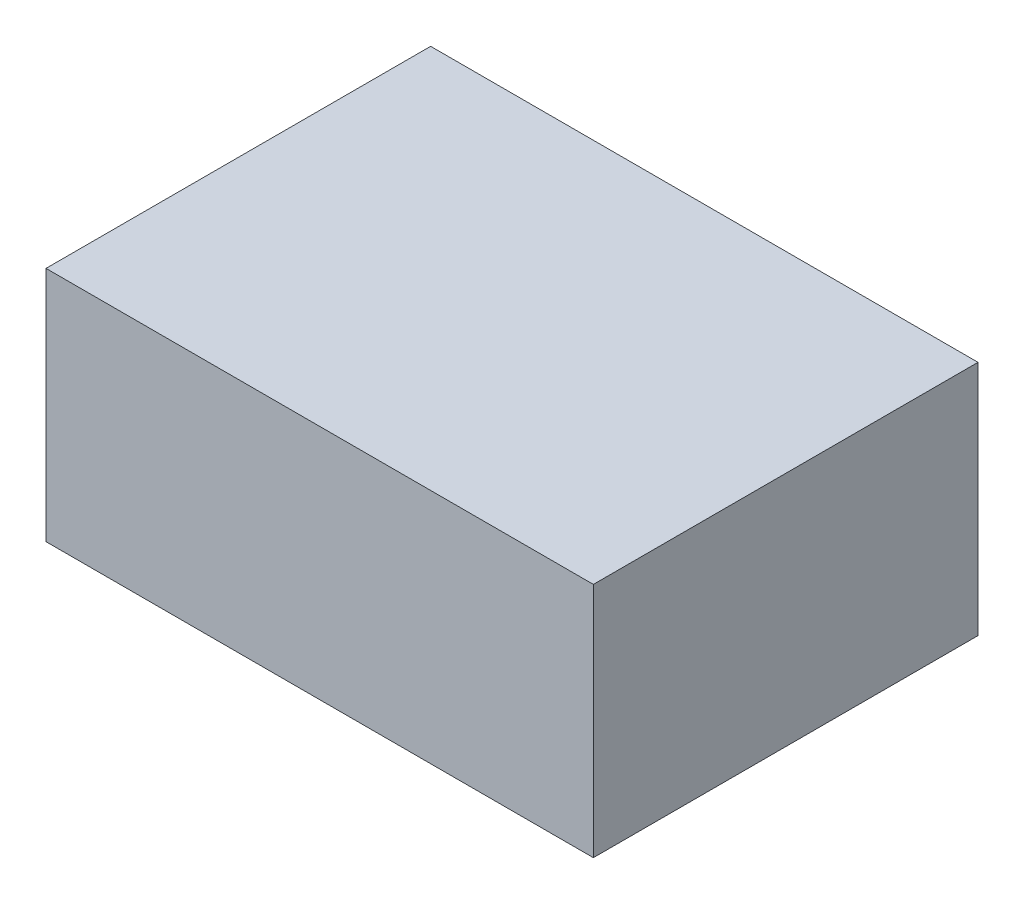
ISO-10303-21;
HEADER;
FILE_DESCRIPTION(('STEP AP214'),'2;1');
FILE_NAME('part.step','',(''),(''),'','','');
FILE_SCHEMA(('AUTOMOTIVE_DESIGN { 1 0 10303 214 1 1 1 1 }'));
ENDSEC;
DATA;
#1=APPLICATION_CONTEXT('core data for automotive mechanical design processes');
#2=APPLICATION_PROTOCOL_DEFINITION('international standard','automotive_design',2000,#1);
#3=PRODUCT_CONTEXT('',#1,'mechanical');
#4=PRODUCT('Part','Part','',(#3));
#5=PRODUCT_RELATED_PRODUCT_CATEGORY('part','',(#4));
#6=PRODUCT_DEFINITION_FORMATION('','',#4);
#7=PRODUCT_DEFINITION_CONTEXT('part definition',#1,'design');
#8=PRODUCT_DEFINITION('design','',#6,#7);
#9=PRODUCT_DEFINITION_SHAPE('','',#8);
#10=(LENGTH_UNIT() NAMED_UNIT(*) SI_UNIT(.MILLI.,.METRE.));
#11=(NAMED_UNIT(*) PLANE_ANGLE_UNIT() SI_UNIT($,.RADIAN.));
#12=(NAMED_UNIT(*) SI_UNIT($,.STERADIAN.) SOLID_ANGLE_UNIT());
#13=UNCERTAINTY_MEASURE_WITH_UNIT(LENGTH_MEASURE(1.E-05),#10,'distance_accuracy_value','');
#14=(GEOMETRIC_REPRESENTATION_CONTEXT(3) GLOBAL_UNCERTAINTY_ASSIGNED_CONTEXT((#13)) GLOBAL_UNIT_ASSIGNED_CONTEXT((#10,
#11,#12)) REPRESENTATION_CONTEXT('',''));
#15=CARTESIAN_POINT('',(0.,0.,0.));
#16=DIRECTION('',(0.,0.,1.));
#17=DIRECTION('',(1.,0.,0.));
#18=AXIS2_PLACEMENT_3D('',#15,#16,#17);
#19=CARTESIAN_POINT('',(46.99,20.32,33.02));
#20=DIRECTION('',(-1.,0.,0.));
#21=DIRECTION('',(0.,0.,1.));
#22=AXIS2_PLACEMENT_3D('',#19,#20,#21);
#23=PLANE('',#22);
#24=DIRECTION('',(0.,0.,-1.));
#25=VECTOR('',#24,1.);
#26=CARTESIAN_POINT('',(46.99,-20.32,33.02));
#27=LINE('',#26,#25);
#28=CARTESIAN_POINT('',(46.99,-20.32,33.02));
#29=VERTEX_POINT('',#28);
#30=CARTESIAN_POINT('',(46.99,-20.32,-33.02));
#31=VERTEX_POINT('',#30);
#32=EDGE_CURVE('E107',#29,#31,#27,.T.);
#33=ORIENTED_EDGE('',*,*,#32,.T.);
#34=DIRECTION('',(0.,-1.,0.));
#35=VECTOR('',#34,1.);
#36=CARTESIAN_POINT('',(46.99,20.32,-33.02));
#37=LINE('',#36,#35);
#38=CARTESIAN_POINT('',(46.99,20.32,-33.02));
#39=VERTEX_POINT('',#38);
#40=EDGE_CURVE('E11',#39,#31,#37,.T.);
#41=ORIENTED_EDGE('',*,*,#40,.F.);
#42=DIRECTION('',(0.,0.,-1.));
#43=VECTOR('',#42,1.);
#44=CARTESIAN_POINT('',(46.99,20.32,33.02));
#45=LINE('',#44,#43);
#46=CARTESIAN_POINT('',(46.99,20.32,33.02));
#47=VERTEX_POINT('',#46);
#48=EDGE_CURVE('E91',#47,#39,#45,.T.);
#49=ORIENTED_EDGE('',*,*,#48,.F.);
#50=DIRECTION('',(0.,-1.,0.));
#51=VECTOR('',#50,1.);
#52=CARTESIAN_POINT('',(46.99,20.32,33.02));
#53=LINE('',#52,#51);
#54=EDGE_CURVE('E103',#47,#29,#53,.T.);
#55=ORIENTED_EDGE('',*,*,#54,.T.);
#56=EDGE_LOOP('',(#33,#41,#49,#55));
#57=FACE_BOUND('',#56,.T.);
#58=ADVANCED_FACE('F39',(#57),#23,.F.);
#59=CARTESIAN_POINT('',(-46.99,20.32,-33.02));
#60=DIRECTION('',(0.,0.,1.));
#61=DIRECTION('',(1.,0.,0.));
#62=AXIS2_PLACEMENT_3D('',#59,#60,#61);
#63=PLANE('',#62);
#64=DIRECTION('',(-1.,0.,0.));
#65=VECTOR('',#64,1.);
#66=CARTESIAN_POINT('',(-46.99,-20.32,-33.02));
#67=LINE('',#66,#65);
#68=CARTESIAN_POINT('',(-46.99,-20.32,-33.02));
#69=VERTEX_POINT('',#68);
#70=EDGE_CURVE('E96',#31,#69,#67,.T.);
#71=ORIENTED_EDGE('',*,*,#70,.T.);
#72=DIRECTION('',(0.,-1.,0.));
#73=VECTOR('',#72,1.);
#74=CARTESIAN_POINT('',(-46.99,20.32,-33.02));
#75=LINE('',#74,#73);
#76=CARTESIAN_POINT('',(-46.99,20.32,-33.02));
#77=VERTEX_POINT('',#76);
#78=EDGE_CURVE('E48',#77,#69,#75,.T.);
#79=ORIENTED_EDGE('',*,*,#78,.F.);
#80=DIRECTION('',(-1.,0.,0.));
#81=VECTOR('',#80,1.);
#82=CARTESIAN_POINT('',(-46.99,20.32,-33.02));
#83=LINE('',#82,#81);
#84=EDGE_CURVE('E86',#39,#77,#83,.T.);
#85=ORIENTED_EDGE('',*,*,#84,.F.);
#86=ORIENTED_EDGE('',*,*,#40,.T.);
#87=EDGE_LOOP('',(#71,#79,#85,#86));
#88=FACE_BOUND('',#87,.T.);
#89=ADVANCED_FACE('F95',(#88),#63,.F.);
#90=CARTESIAN_POINT('',(-46.99,20.32,33.02));
#91=DIRECTION('',(1.,0.,0.));
#92=DIRECTION('',(0.,0.,-1.));
#93=AXIS2_PLACEMENT_3D('',#90,#91,#92);
#94=PLANE('',#93);
#95=DIRECTION('',(0.,0.,1.));
#96=VECTOR('',#95,1.);
#97=CARTESIAN_POINT('',(-46.99,-20.32,33.02));
#98=LINE('',#97,#96);
#99=CARTESIAN_POINT('',(-46.99,-20.32,33.02));
#100=VERTEX_POINT('',#99);
#101=EDGE_CURVE('E73',#69,#100,#98,.T.);
#102=ORIENTED_EDGE('',*,*,#101,.T.);
#103=DIRECTION('',(0.,-1.,0.));
#104=VECTOR('',#103,1.);
#105=CARTESIAN_POINT('',(-46.99,20.32,33.02));
#106=LINE('',#105,#104);
#107=CARTESIAN_POINT('',(-46.99,20.32,33.02));
#108=VERTEX_POINT('',#107);
#109=EDGE_CURVE('E98',#108,#100,#106,.T.);
#110=ORIENTED_EDGE('',*,*,#109,.F.);
#111=DIRECTION('',(0.,0.,1.));
#112=VECTOR('',#111,1.);
#113=CARTESIAN_POINT('',(-46.99,20.32,33.02));
#114=LINE('',#113,#112);
#115=EDGE_CURVE('E89',#77,#108,#114,.T.);
#116=ORIENTED_EDGE('',*,*,#115,.F.);
#117=ORIENTED_EDGE('',*,*,#78,.T.);
#118=EDGE_LOOP('',(#102,#110,#116,#117));
#119=FACE_BOUND('',#118,.T.);
#120=ADVANCED_FACE('F99',(#119),#94,.F.);
#121=CARTESIAN_POINT('',(-46.99,20.32,33.02));
#122=DIRECTION('',(0.,0.,-1.));
#123=DIRECTION('',(-1.,0.,0.));
#124=AXIS2_PLACEMENT_3D('',#121,#122,#123);
#125=PLANE('',#124);
#126=DIRECTION('',(1.,0.,0.));
#127=VECTOR('',#126,1.);
#128=CARTESIAN_POINT('',(-46.99,-20.32,33.02));
#129=LINE('',#128,#127);
#130=EDGE_CURVE('E79',#100,#29,#129,.T.);
#131=ORIENTED_EDGE('',*,*,#130,.T.);
#132=ORIENTED_EDGE('',*,*,#54,.F.);
#133=DIRECTION('',(1.,0.,0.));
#134=VECTOR('',#133,1.);
#135=CARTESIAN_POINT('',(-46.99,20.32,33.02));
#136=LINE('',#135,#134);
#137=EDGE_CURVE('E56',#108,#47,#136,.T.);
#138=ORIENTED_EDGE('',*,*,#137,.F.);
#139=ORIENTED_EDGE('',*,*,#109,.T.);
#140=EDGE_LOOP('',(#131,#132,#138,#139));
#141=FACE_BOUND('',#140,.T.);
#142=ADVANCED_FACE('F120',(#141),#125,.F.);
#143=CARTESIAN_POINT('',(0.,20.32,0.));
#144=DIRECTION('',(0.,-1.,0.));
#145=DIRECTION('',(0.,0.,-1.));
#146=AXIS2_PLACEMENT_3D('',#143,#144,#145);
#147=PLANE('',#146);
#148=ORIENTED_EDGE('',*,*,#48,.T.);
#149=ORIENTED_EDGE('',*,*,#84,.T.);
#150=ORIENTED_EDGE('',*,*,#115,.T.);
#151=ORIENTED_EDGE('',*,*,#137,.T.);
#152=EDGE_LOOP('',(#148,#149,#150,#151));
#153=FACE_BOUND('',#152,.T.);
#154=ADVANCED_FACE('F87',(#153),#147,.F.);
#155=CARTESIAN_POINT('',(0.,-20.32,0.));
#156=DIRECTION('',(0.,-1.,0.));
#157=DIRECTION('',(0.,0.,-1.));
#158=AXIS2_PLACEMENT_3D('',#155,#156,#157);
#159=PLANE('',#158);
#160=ORIENTED_EDGE('',*,*,#32,.F.);
#161=ORIENTED_EDGE('',*,*,#130,.F.);
#162=ORIENTED_EDGE('',*,*,#101,.F.);
#163=ORIENTED_EDGE('',*,*,#70,.F.);
#164=EDGE_LOOP('',(#160,#161,#162,#163));
#165=FACE_BOUND('',#164,.T.);
#166=ADVANCED_FACE('F123',(#165),#159,.T.);
#167=CLOSED_SHELL('',(#58,#89,#120,#142,#154,#166));
#168=MANIFOLD_SOLID_BREP('B2',#167);
#169=ADVANCED_BREP_SHAPE_REPRESENTATION('',(#18,#168),#14);
#170=SHAPE_DEFINITION_REPRESENTATION(#9,#169);
ENDSEC;
END-ISO-10303-21;
